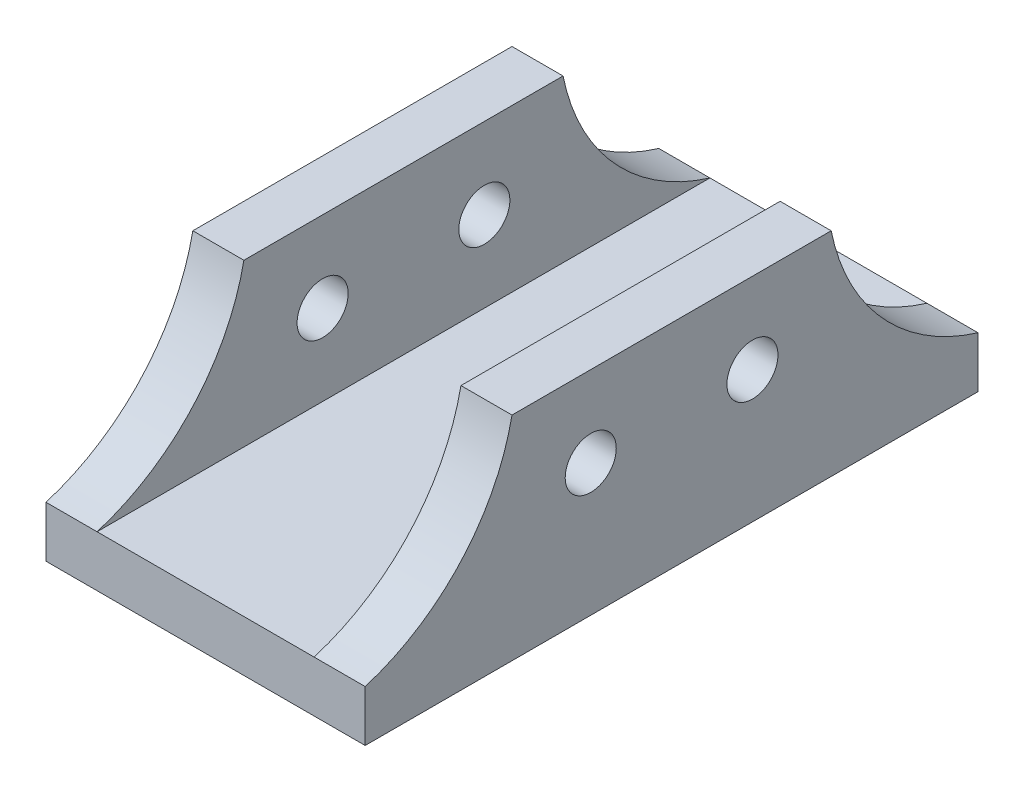
ISO-10303-21;
HEADER;
FILE_DESCRIPTION(('STEP AP214'),'2;1');
FILE_NAME('part.step','',(''),(''),'','','');
FILE_SCHEMA(('AUTOMOTIVE_DESIGN { 1 0 10303 214 1 1 1 1 }'));
ENDSEC;
DATA;
#1=APPLICATION_CONTEXT('core data for automotive mechanical design processes');
#2=APPLICATION_PROTOCOL_DEFINITION('international standard','automotive_design',2000,#1);
#3=PRODUCT_CONTEXT('',#1,'mechanical');
#4=PRODUCT('Part','Part','',(#3));
#5=PRODUCT_RELATED_PRODUCT_CATEGORY('part','',(#4));
#6=PRODUCT_DEFINITION_FORMATION('','',#4);
#7=PRODUCT_DEFINITION_CONTEXT('part definition',#1,'design');
#8=PRODUCT_DEFINITION('design','',#6,#7);
#9=PRODUCT_DEFINITION_SHAPE('','',#8);
#10=(LENGTH_UNIT() NAMED_UNIT(*) SI_UNIT(.MILLI.,.METRE.));
#11=(NAMED_UNIT(*) PLANE_ANGLE_UNIT() SI_UNIT($,.RADIAN.));
#12=(NAMED_UNIT(*) SI_UNIT($,.STERADIAN.) SOLID_ANGLE_UNIT());
#13=UNCERTAINTY_MEASURE_WITH_UNIT(LENGTH_MEASURE(1.E-05),#10,'distance_accuracy_value','');
#14=(GEOMETRIC_REPRESENTATION_CONTEXT(3) GLOBAL_UNCERTAINTY_ASSIGNED_CONTEXT((#13)) GLOBAL_UNIT_ASSIGNED_CONTEXT((#10,
#11,#12)) REPRESENTATION_CONTEXT('',''));
#15=CARTESIAN_POINT('',(0.,0.,0.));
#16=DIRECTION('',(0.,0.,1.));
#17=DIRECTION('',(1.,0.,0.));
#18=AXIS2_PLACEMENT_3D('',#15,#16,#17);
#19=CARTESIAN_POINT('',(37.5,50.,72.));
#20=DIRECTION('',(0.,-1.,0.));
#21=DIRECTION('',(0.,0.,-1.));
#22=AXIS2_PLACEMENT_3D('',#19,#20,#21);
#23=PLANE('',#22);
#24=DIRECTION('',(1.,0.,0.));
#25=VECTOR('',#24,1.);
#26=CARTESIAN_POINT('',(-37.5,50.,-37.5));
#27=LINE('',#26,#25);
#28=CARTESIAN_POINT('',(-37.5,50.,-37.5));
#29=VERTEX_POINT('',#28);
#30=CARTESIAN_POINT('',(-25.5,50.,-37.5));
#31=VERTEX_POINT('',#30);
#32=EDGE_CURVE('E53',#29,#31,#27,.T.);
#33=ORIENTED_EDGE('',*,*,#32,.F.);
#34=DIRECTION('',(0.,0.,1.));
#35=VECTOR('',#34,1.);
#36=CARTESIAN_POINT('',(-37.5,50.,72.));
#37=LINE('',#36,#35);
#38=CARTESIAN_POINT('',(-37.5,50.,37.5));
#39=VERTEX_POINT('',#38);
#40=EDGE_CURVE('E129',#29,#39,#37,.T.);
#41=ORIENTED_EDGE('',*,*,#40,.T.);
#42=DIRECTION('',(1.,0.,0.));
#43=VECTOR('',#42,1.);
#44=CARTESIAN_POINT('',(-37.5,50.,37.5));
#45=LINE('',#44,#43);
#46=CARTESIAN_POINT('',(-25.5,50.,37.5));
#47=VERTEX_POINT('',#46);
#48=EDGE_CURVE('E231',#39,#47,#45,.T.);
#49=ORIENTED_EDGE('',*,*,#48,.T.);
#50=DIRECTION('',(0.,0.,1.));
#51=VECTOR('',#50,1.);
#52=CARTESIAN_POINT('',(-25.5,50.,-72.));
#53=LINE('',#52,#51);
#54=EDGE_CURVE('E132',#31,#47,#53,.T.);
#55=ORIENTED_EDGE('',*,*,#54,.F.);
#56=EDGE_LOOP('',(#33,#41,#49,#55));
#57=FACE_BOUND('',#56,.T.);
#58=ADVANCED_FACE('F39',(#57),#23,.F.);
#59=CARTESIAN_POINT('',(25.5,50.,-37.5));
#60=VERTEX_POINT('',#59);
#61=CARTESIAN_POINT('',(37.5,50.,-37.5));
#62=VERTEX_POINT('',#61);
#63=EDGE_CURVE('E121',#60,#62,#27,.T.);
#64=ORIENTED_EDGE('',*,*,#63,.F.);
#65=DIRECTION('',(0.,0.,1.));
#66=VECTOR('',#65,1.);
#67=CARTESIAN_POINT('',(25.5,50.,-72.));
#68=LINE('',#67,#66);
#69=CARTESIAN_POINT('',(25.5,50.,37.5));
#70=VERTEX_POINT('',#69);
#71=EDGE_CURVE('E167',#60,#70,#68,.T.);
#72=ORIENTED_EDGE('',*,*,#71,.T.);
#73=CARTESIAN_POINT('',(37.5,50.,37.5));
#74=VERTEX_POINT('',#73);
#75=EDGE_CURVE('E65',#70,#74,#45,.T.);
#76=ORIENTED_EDGE('',*,*,#75,.T.);
#77=DIRECTION('',(0.,0.,1.));
#78=VECTOR('',#77,1.);
#79=CARTESIAN_POINT('',(37.5,50.,72.));
#80=LINE('',#79,#78);
#81=EDGE_CURVE('E151',#62,#74,#80,.T.);
#82=ORIENTED_EDGE('',*,*,#81,.F.);
#83=EDGE_LOOP('',(#64,#72,#76,#82));
#84=FACE_BOUND('',#83,.T.);
#85=ADVANCED_FACE('F174',(#84),#23,.F.);
#86=CARTESIAN_POINT('',(37.5,0.,72.));
#87=DIRECTION('',(0.,0.,-1.));
#88=DIRECTION('',(-1.,0.,0.));
#89=AXIS2_PLACEMENT_3D('',#86,#87,#88);
#90=PLANE('',#89);
#91=DIRECTION('',(1.,0.,0.));
#92=VECTOR('',#91,1.);
#93=CARTESIAN_POINT('',(-37.5,12.,72.));
#94=LINE('',#93,#92);
#95=CARTESIAN_POINT('',(-37.5,12.,72.));
#96=VERTEX_POINT('',#95);
#97=CARTESIAN_POINT('',(-25.5,12.,72.));
#98=VERTEX_POINT('',#97);
#99=EDGE_CURVE('E227',#96,#98,#94,.T.);
#100=ORIENTED_EDGE('',*,*,#99,.F.);
#101=DIRECTION('',(0.,-1.,0.));
#102=VECTOR('',#101,1.);
#103=CARTESIAN_POINT('',(-37.5,0.,72.));
#104=LINE('',#103,#102);
#105=CARTESIAN_POINT('',(-37.5,0.,72.));
#106=VERTEX_POINT('',#105);
#107=EDGE_CURVE('E200',#96,#106,#104,.T.);
#108=ORIENTED_EDGE('',*,*,#107,.T.);
#109=DIRECTION('',(-1.,0.,0.));
#110=VECTOR('',#109,1.);
#111=CARTESIAN_POINT('',(37.5,0.,72.));
#112=LINE('',#111,#110);
#113=CARTESIAN_POINT('',(37.5,0.,72.));
#114=VERTEX_POINT('',#113);
#115=EDGE_CURVE('E147',#114,#106,#112,.T.);
#116=ORIENTED_EDGE('',*,*,#115,.F.);
#117=DIRECTION('',(0.,-1.,0.));
#118=VECTOR('',#117,1.);
#119=CARTESIAN_POINT('',(37.5,0.,72.));
#120=LINE('',#119,#118);
#121=CARTESIAN_POINT('',(37.5,12.,72.));
#122=VERTEX_POINT('',#121);
#123=EDGE_CURVE('E140',#122,#114,#120,.T.);
#124=ORIENTED_EDGE('',*,*,#123,.F.);
#125=CARTESIAN_POINT('',(25.5,12.,72.));
#126=VERTEX_POINT('',#125);
#127=EDGE_CURVE('E228',#126,#122,#94,.T.);
#128=ORIENTED_EDGE('',*,*,#127,.F.);
#129=DIRECTION('',(1.,0.,0.));
#130=VECTOR('',#129,1.);
#131=CARTESIAN_POINT('',(-25.5,12.,72.));
#132=LINE('',#131,#130);
#133=EDGE_CURVE('E230',#98,#126,#132,.T.);
#134=ORIENTED_EDGE('',*,*,#133,.F.);
#135=EDGE_LOOP('',(#100,#108,#116,#124,#128,#134));
#136=FACE_BOUND('',#135,.T.);
#137=ADVANCED_FACE('F41',(#136),#90,.F.);
#138=CARTESIAN_POINT('',(37.5,0.,0.));
#139=DIRECTION('',(-1.,0.,0.));
#140=DIRECTION('',(0.,0.,1.));
#141=AXIS2_PLACEMENT_3D('',#138,#139,#140);
#142=PLANE('',#141);
#143=CARTESIAN_POINT('',(37.5,31.,19.));
#144=DIRECTION('',(1.,0.,0.));
#145=DIRECTION('',(0.,0.,-1.));
#146=AXIS2_PLACEMENT_3D('',#143,#144,#145);
#147=CIRCLE('',#146,6.);
#148=CARTESIAN_POINT('',(37.5,31.,13.));
#149=VERTEX_POINT('',#148);
#150=EDGE_CURVE('E198',#149,#149,#147,.T.);
#151=ORIENTED_EDGE('',*,*,#150,.F.);
#152=EDGE_LOOP('',(#151));
#153=FACE_BOUND('',#152,.T.);
#154=CARTESIAN_POINT('',(37.5,31.,-19.));
#155=DIRECTION('',(1.,0.,0.));
#156=DIRECTION('',(0.,0.,1.));
#157=AXIS2_PLACEMENT_3D('',#154,#155,#156);
#158=CIRCLE('',#157,6.);
#159=CARTESIAN_POINT('',(37.5,31.,-13.));
#160=VERTEX_POINT('',#159);
#161=EDGE_CURVE('E188',#160,#160,#158,.T.);
#162=ORIENTED_EDGE('',*,*,#161,.F.);
#163=EDGE_LOOP('',(#162));
#164=FACE_BOUND('',#163,.T.);
#165=CARTESIAN_POINT('',(37.5,59.8449036256035,-86.5211981963169));
#166=DIRECTION('',(1.,0.,0.));
#167=DIRECTION('',(0.,0.,-1.));
#168=AXIS2_PLACEMENT_3D('',#165,#166,#167);
#169=CIRCLE('',#168,50.);
#170=CARTESIAN_POINT('',(37.5,12.,-72.));
#171=VERTEX_POINT('',#170);
#172=EDGE_CURVE('E125',#62,#171,#169,.T.);
#173=ORIENTED_EDGE('',*,*,#172,.F.);
#174=ORIENTED_EDGE('',*,*,#81,.T.);
#175=CARTESIAN_POINT('',(37.5,59.8449036256035,86.5211981963169));
#176=DIRECTION('',(1.,0.,0.));
#177=DIRECTION('',(0.,0.,1.));
#178=AXIS2_PLACEMENT_3D('',#175,#176,#177);
#179=CIRCLE('',#178,50.);
#180=EDGE_CURVE('E232',#122,#74,#179,.T.);
#181=ORIENTED_EDGE('',*,*,#180,.F.);
#182=ORIENTED_EDGE('',*,*,#123,.T.);
#183=DIRECTION('',(0.,0.,-1.));
#184=VECTOR('',#183,1.);
#185=CARTESIAN_POINT('',(37.5,0.,72.));
#186=LINE('',#185,#184);
#187=CARTESIAN_POINT('',(37.5,0.,-72.));
#188=VERTEX_POINT('',#187);
#189=EDGE_CURVE('E143',#114,#188,#186,.T.);
#190=ORIENTED_EDGE('',*,*,#189,.T.);
#191=DIRECTION('',(0.,1.,0.));
#192=VECTOR('',#191,1.);
#193=CARTESIAN_POINT('',(37.5,0.,-72.));
#194=LINE('',#193,#192);
#195=EDGE_CURVE('E201',#188,#171,#194,.T.);
#196=ORIENTED_EDGE('',*,*,#195,.T.);
#197=EDGE_LOOP('',(#173,#174,#181,#182,#190,#196));
#198=FACE_BOUND('',#197,.T.);
#199=ADVANCED_FACE('F219',(#153,#164,#198),#142,.F.);
#200=CARTESIAN_POINT('',(-37.5,0.,0.));
#201=DIRECTION('',(-1.,0.,0.));
#202=DIRECTION('',(0.,0.,1.));
#203=AXIS2_PLACEMENT_3D('',#200,#201,#202);
#204=PLANE('',#203);
#205=CARTESIAN_POINT('',(-37.5,31.,19.));
#206=DIRECTION('',(1.,0.,0.));
#207=DIRECTION('',(0.,0.,-1.));
#208=AXIS2_PLACEMENT_3D('',#205,#206,#207);
#209=CIRCLE('',#208,6.);
#210=CARTESIAN_POINT('',(-37.5,31.,13.));
#211=VERTEX_POINT('',#210);
#212=EDGE_CURVE('E195',#211,#211,#209,.T.);
#213=ORIENTED_EDGE('',*,*,#212,.T.);
#214=EDGE_LOOP('',(#213));
#215=FACE_BOUND('',#214,.T.);
#216=CARTESIAN_POINT('',(-37.5,31.,-19.));
#217=DIRECTION('',(1.,0.,0.));
#218=DIRECTION('',(0.,0.,1.));
#219=AXIS2_PLACEMENT_3D('',#216,#217,#218);
#220=CIRCLE('',#219,6.);
#221=CARTESIAN_POINT('',(-37.5,31.,-13.));
#222=VERTEX_POINT('',#221);
#223=EDGE_CURVE('E186',#222,#222,#220,.T.);
#224=ORIENTED_EDGE('',*,*,#223,.T.);
#225=EDGE_LOOP('',(#224));
#226=FACE_BOUND('',#225,.T.);
#227=ORIENTED_EDGE('',*,*,#40,.F.);
#228=CARTESIAN_POINT('',(-37.5,59.8449036256035,-86.5211981963169));
#229=DIRECTION('',(1.,0.,0.));
#230=DIRECTION('',(0.,0.,-1.));
#231=AXIS2_PLACEMENT_3D('',#228,#229,#230);
#232=CIRCLE('',#231,50.);
#233=CARTESIAN_POINT('',(-37.5,12.,-72.));
#234=VERTEX_POINT('',#233);
#235=EDGE_CURVE('E111',#29,#234,#232,.T.);
#236=ORIENTED_EDGE('',*,*,#235,.T.);
#237=DIRECTION('',(0.,1.,0.));
#238=VECTOR('',#237,1.);
#239=CARTESIAN_POINT('',(-37.5,0.,-72.));
#240=LINE('',#239,#238);
#241=CARTESIAN_POINT('',(-37.5,0.,-72.));
#242=VERTEX_POINT('',#241);
#243=EDGE_CURVE('E138',#242,#234,#240,.T.);
#244=ORIENTED_EDGE('',*,*,#243,.F.);
#245=DIRECTION('',(0.,0.,-1.));
#246=VECTOR('',#245,1.);
#247=CARTESIAN_POINT('',(-37.5,0.,72.));
#248=LINE('',#247,#246);
#249=EDGE_CURVE('E141',#106,#242,#248,.T.);
#250=ORIENTED_EDGE('',*,*,#249,.F.);
#251=ORIENTED_EDGE('',*,*,#107,.F.);
#252=CARTESIAN_POINT('',(-37.5,59.8449036256035,86.5211981963169));
#253=DIRECTION('',(1.,0.,0.));
#254=DIRECTION('',(0.,0.,1.));
#255=AXIS2_PLACEMENT_3D('',#252,#253,#254);
#256=CIRCLE('',#255,50.);
#257=EDGE_CURVE('E136',#96,#39,#256,.T.);
#258=ORIENTED_EDGE('',*,*,#257,.T.);
#259=EDGE_LOOP('',(#227,#236,#244,#250,#251,#258));
#260=FACE_BOUND('',#259,.T.);
#261=ADVANCED_FACE('F133',(#215,#226,#260),#204,.T.);
#262=CARTESIAN_POINT('',(37.5,31.,19.));
#263=DIRECTION('',(-1.,0.,0.));
#264=DIRECTION('',(0.,0.,1.));
#265=AXIS2_PLACEMENT_3D('',#262,#263,#264);
#266=CYLINDRICAL_SURFACE('',#265,6.);
#267=CARTESIAN_POINT('',(-25.5,31.,19.));
#268=DIRECTION('',(-1.,0.,0.));
#269=DIRECTION('',(0.,-1.,0.));
#270=AXIS2_PLACEMENT_3D('',#267,#268,#269);
#271=CIRCLE('',#270,6.);
#272=CARTESIAN_POINT('',(-25.5,25.,19.));
#273=VERTEX_POINT('',#272);
#274=EDGE_CURVE('E159',#273,#273,#271,.T.);
#275=ORIENTED_EDGE('',*,*,#274,.F.);
#276=EDGE_LOOP('',(#275));
#277=FACE_BOUND('',#276,.T.);
#278=ORIENTED_EDGE('',*,*,#212,.F.);
#279=EDGE_LOOP('',(#278));
#280=FACE_BOUND('',#279,.T.);
#281=ADVANCED_FACE('F279',(#277,#280),#266,.F.);
#282=CARTESIAN_POINT('',(37.5,31.,-19.));
#283=DIRECTION('',(-1.,0.,0.));
#284=DIRECTION('',(0.,0.,1.));
#285=AXIS2_PLACEMENT_3D('',#282,#283,#284);
#286=CYLINDRICAL_SURFACE('',#285,6.);
#287=CARTESIAN_POINT('',(-25.5,31.,-19.));
#288=DIRECTION('',(-1.,0.,0.));
#289=DIRECTION('',(0.,-1.,0.));
#290=AXIS2_PLACEMENT_3D('',#287,#288,#289);
#291=CIRCLE('',#290,6.);
#292=CARTESIAN_POINT('',(-25.5,25.,-19.));
#293=VERTEX_POINT('',#292);
#294=EDGE_CURVE('E158',#293,#293,#291,.T.);
#295=ORIENTED_EDGE('',*,*,#294,.F.);
#296=EDGE_LOOP('',(#295));
#297=FACE_BOUND('',#296,.T.);
#298=ORIENTED_EDGE('',*,*,#223,.F.);
#299=EDGE_LOOP('',(#298));
#300=FACE_BOUND('',#299,.T.);
#301=ADVANCED_FACE('F272',(#297,#300),#286,.F.);
#302=CARTESIAN_POINT('',(37.5,0.,72.));
#303=DIRECTION('',(0.,1.,0.));
#304=DIRECTION('',(0.,0.,1.));
#305=AXIS2_PLACEMENT_3D('',#302,#303,#304);
#306=PLANE('',#305);
#307=ORIENTED_EDGE('',*,*,#249,.T.);
#308=DIRECTION('',(-1.,0.,0.));
#309=VECTOR('',#308,1.);
#310=CARTESIAN_POINT('',(37.5,0.,-72.));
#311=LINE('',#310,#309);
#312=EDGE_CURVE('E150',#188,#242,#311,.T.);
#313=ORIENTED_EDGE('',*,*,#312,.F.);
#314=ORIENTED_EDGE('',*,*,#189,.F.);
#315=ORIENTED_EDGE('',*,*,#115,.T.);
#316=EDGE_LOOP('',(#307,#313,#314,#315));
#317=FACE_BOUND('',#316,.T.);
#318=ADVANCED_FACE('F209',(#317),#306,.F.);
#319=CARTESIAN_POINT('',(37.5,0.,-72.));
#320=DIRECTION('',(0.,0.,1.));
#321=DIRECTION('',(1.,0.,0.));
#322=AXIS2_PLACEMENT_3D('',#319,#320,#321);
#323=PLANE('',#322);
#324=ORIENTED_EDGE('',*,*,#243,.T.);
#325=DIRECTION('',(1.,0.,0.));
#326=VECTOR('',#325,1.);
#327=CARTESIAN_POINT('',(-37.5,12.,-72.));
#328=LINE('',#327,#326);
#329=CARTESIAN_POINT('',(-25.5,12.,-72.));
#330=VERTEX_POINT('',#329);
#331=EDGE_CURVE('E120',#234,#330,#328,.T.);
#332=ORIENTED_EDGE('',*,*,#331,.T.);
#333=DIRECTION('',(1.,0.,0.));
#334=VECTOR('',#333,1.);
#335=CARTESIAN_POINT('',(-25.5,12.,-72.));
#336=LINE('',#335,#334);
#337=CARTESIAN_POINT('',(25.5,12.,-72.));
#338=VERTEX_POINT('',#337);
#339=EDGE_CURVE('E184',#330,#338,#336,.T.);
#340=ORIENTED_EDGE('',*,*,#339,.T.);
#341=EDGE_CURVE('E135',#338,#171,#328,.T.);
#342=ORIENTED_EDGE('',*,*,#341,.T.);
#343=ORIENTED_EDGE('',*,*,#195,.F.);
#344=ORIENTED_EDGE('',*,*,#312,.T.);
#345=EDGE_LOOP('',(#324,#332,#340,#342,#343,#344));
#346=FACE_BOUND('',#345,.T.);
#347=ADVANCED_FACE('F214',(#346),#323,.F.);
#348=CARTESIAN_POINT('',(25.5,31.,19.));
#349=DIRECTION('',(1.,0.,0.));
#350=DIRECTION('',(0.,1.,0.));
#351=AXIS2_PLACEMENT_3D('',#348,#349,#350);
#352=CIRCLE('',#351,6.);
#353=CARTESIAN_POINT('',(25.5,37.,19.));
#354=VERTEX_POINT('',#353);
#355=EDGE_CURVE('E160',#354,#354,#352,.T.);
#356=ORIENTED_EDGE('',*,*,#355,.F.);
#357=EDGE_LOOP('',(#356));
#358=FACE_BOUND('',#357,.T.);
#359=ORIENTED_EDGE('',*,*,#150,.T.);
#360=EDGE_LOOP('',(#359));
#361=FACE_BOUND('',#360,.T.);
#362=ADVANCED_FACE('F271',(#358,#361),#266,.F.);
#363=CARTESIAN_POINT('',(25.5,31.,-19.));
#364=DIRECTION('',(1.,0.,0.));
#365=DIRECTION('',(0.,1.,0.));
#366=AXIS2_PLACEMENT_3D('',#363,#364,#365);
#367=CIRCLE('',#366,6.);
#368=CARTESIAN_POINT('',(25.5,37.,-19.));
#369=VERTEX_POINT('',#368);
#370=EDGE_CURVE('E152',#369,#369,#367,.T.);
#371=ORIENTED_EDGE('',*,*,#370,.F.);
#372=EDGE_LOOP('',(#371));
#373=FACE_BOUND('',#372,.T.);
#374=ORIENTED_EDGE('',*,*,#161,.T.);
#375=EDGE_LOOP('',(#374));
#376=FACE_BOUND('',#375,.T.);
#377=ADVANCED_FACE('F282',(#373,#376),#286,.F.);
#378=CARTESIAN_POINT('',(-25.5,50.,-72.));
#379=DIRECTION('',(-1.,0.,0.));
#380=DIRECTION('',(0.,-1.,0.));
#381=AXIS2_PLACEMENT_3D('',#378,#379,#380);
#382=PLANE('',#381);
#383=ORIENTED_EDGE('',*,*,#274,.T.);
#384=EDGE_LOOP('',(#383));
#385=FACE_BOUND('',#384,.T.);
#386=ORIENTED_EDGE('',*,*,#294,.T.);
#387=EDGE_LOOP('',(#386));
#388=FACE_BOUND('',#387,.T.);
#389=DIRECTION('',(0.,0.,1.));
#390=VECTOR('',#389,1.);
#391=CARTESIAN_POINT('',(-25.5,12.,-72.));
#392=LINE('',#391,#390);
#393=EDGE_CURVE('E180',#330,#98,#392,.T.);
#394=ORIENTED_EDGE('',*,*,#393,.F.);
#395=CARTESIAN_POINT('',(-25.5,59.8449036256035,-86.5211981963169));
#396=DIRECTION('',(-1.,0.,0.));
#397=DIRECTION('',(0.,-1.,0.));
#398=AXIS2_PLACEMENT_3D('',#395,#396,#397);
#399=CIRCLE('',#398,50.);
#400=EDGE_CURVE('E238',#330,#31,#399,.T.);
#401=ORIENTED_EDGE('',*,*,#400,.T.);
#402=ORIENTED_EDGE('',*,*,#54,.T.);
#403=CARTESIAN_POINT('',(-25.5,59.8449036256035,86.5211981963169));
#404=DIRECTION('',(-1.,0.,0.));
#405=DIRECTION('',(0.,-1.,0.));
#406=AXIS2_PLACEMENT_3D('',#403,#404,#405);
#407=CIRCLE('',#406,50.);
#408=EDGE_CURVE('E236',#47,#98,#407,.T.);
#409=ORIENTED_EDGE('',*,*,#408,.T.);
#410=EDGE_LOOP('',(#394,#401,#402,#409));
#411=FACE_BOUND('',#410,.T.);
#412=ADVANCED_FACE('F246',(#385,#388,#411),#382,.F.);
#413=CARTESIAN_POINT('',(25.5,50.,-72.));
#414=DIRECTION('',(1.,0.,0.));
#415=DIRECTION('',(0.,1.,0.));
#416=AXIS2_PLACEMENT_3D('',#413,#414,#415);
#417=PLANE('',#416);
#418=ORIENTED_EDGE('',*,*,#355,.T.);
#419=EDGE_LOOP('',(#418));
#420=FACE_BOUND('',#419,.T.);
#421=ORIENTED_EDGE('',*,*,#370,.T.);
#422=EDGE_LOOP('',(#421));
#423=FACE_BOUND('',#422,.T.);
#424=ORIENTED_EDGE('',*,*,#71,.F.);
#425=CARTESIAN_POINT('',(25.5,59.8449036256035,-86.5211981963169));
#426=DIRECTION('',(1.,0.,0.));
#427=DIRECTION('',(0.,1.,0.));
#428=AXIS2_PLACEMENT_3D('',#425,#426,#427);
#429=CIRCLE('',#428,50.);
#430=EDGE_CURVE('E11',#60,#338,#429,.T.);
#431=ORIENTED_EDGE('',*,*,#430,.T.);
#432=DIRECTION('',(0.,0.,1.));
#433=VECTOR('',#432,1.);
#434=CARTESIAN_POINT('',(25.5,12.,-72.));
#435=LINE('',#434,#433);
#436=EDGE_CURVE('E169',#338,#126,#435,.T.);
#437=ORIENTED_EDGE('',*,*,#436,.T.);
#438=CARTESIAN_POINT('',(25.5,59.8449036256035,86.5211981963169));
#439=DIRECTION('',(1.,0.,0.));
#440=DIRECTION('',(0.,1.,0.));
#441=AXIS2_PLACEMENT_3D('',#438,#439,#440);
#442=CIRCLE('',#441,50.);
#443=EDGE_CURVE('E50',#126,#70,#442,.T.);
#444=ORIENTED_EDGE('',*,*,#443,.T.);
#445=EDGE_LOOP('',(#424,#431,#437,#444));
#446=FACE_BOUND('',#445,.T.);
#447=ADVANCED_FACE('F164',(#420,#423,#446),#417,.F.);
#448=CARTESIAN_POINT('',(-25.5,12.,-72.));
#449=DIRECTION('',(0.,-1.,0.));
#450=DIRECTION('',(0.,0.,-1.));
#451=AXIS2_PLACEMENT_3D('',#448,#449,#450);
#452=PLANE('',#451);
#453=ORIENTED_EDGE('',*,*,#133,.T.);
#454=ORIENTED_EDGE('',*,*,#436,.F.);
#455=ORIENTED_EDGE('',*,*,#339,.F.);
#456=ORIENTED_EDGE('',*,*,#393,.T.);
#457=EDGE_LOOP('',(#453,#454,#455,#456));
#458=FACE_BOUND('',#457,.T.);
#459=ADVANCED_FACE('F244',(#458),#452,.F.);
#460=CARTESIAN_POINT('',(-37.5,59.8449036256035,86.5211981963169));
#461=DIRECTION('',(1.,0.,0.));
#462=DIRECTION('',(0.,0.,-1.));
#463=AXIS2_PLACEMENT_3D('',#460,#461,#462);
#464=CYLINDRICAL_SURFACE('',#463,50.);
#465=ORIENTED_EDGE('',*,*,#127,.T.);
#466=ORIENTED_EDGE('',*,*,#180,.T.);
#467=ORIENTED_EDGE('',*,*,#75,.F.);
#468=ORIENTED_EDGE('',*,*,#443,.F.);
#469=EDGE_LOOP('',(#465,#466,#467,#468));
#470=FACE_BOUND('',#469,.T.);
#471=ADVANCED_FACE('F252',(#470),#464,.F.);
#472=CARTESIAN_POINT('',(-37.5,59.8449036256035,-86.5211981963169));
#473=DIRECTION('',(1.,0.,0.));
#474=DIRECTION('',(0.,0.,-1.));
#475=AXIS2_PLACEMENT_3D('',#472,#473,#474);
#476=CYLINDRICAL_SURFACE('',#475,50.);
#477=ORIENTED_EDGE('',*,*,#63,.T.);
#478=ORIENTED_EDGE('',*,*,#172,.T.);
#479=ORIENTED_EDGE('',*,*,#341,.F.);
#480=ORIENTED_EDGE('',*,*,#430,.F.);
#481=EDGE_LOOP('',(#477,#478,#479,#480));
#482=FACE_BOUND('',#481,.T.);
#483=ADVANCED_FACE('F247',(#482),#476,.F.);
#484=ORIENTED_EDGE('',*,*,#48,.F.);
#485=ORIENTED_EDGE('',*,*,#257,.F.);
#486=ORIENTED_EDGE('',*,*,#99,.T.);
#487=ORIENTED_EDGE('',*,*,#408,.F.);
#488=EDGE_LOOP('',(#484,#485,#486,#487));
#489=FACE_BOUND('',#488,.T.);
#490=ADVANCED_FACE('F250',(#489),#464,.F.);
#491=ORIENTED_EDGE('',*,*,#331,.F.);
#492=ORIENTED_EDGE('',*,*,#235,.F.);
#493=ORIENTED_EDGE('',*,*,#32,.T.);
#494=ORIENTED_EDGE('',*,*,#400,.F.);
#495=EDGE_LOOP('',(#491,#492,#493,#494));
#496=FACE_BOUND('',#495,.T.);
#497=ADVANCED_FACE('F113',(#496),#476,.F.);
#498=CLOSED_SHELL('',(#58,#85,#137,#199,#261,#281,#301,#318,#347,#362,#377,#412,#447,#459,#471,
#483,#490,#497));
#499=MANIFOLD_SOLID_BREP('B2',#498);
#500=ADVANCED_BREP_SHAPE_REPRESENTATION('',(#18,#499),#14);
#501=SHAPE_DEFINITION_REPRESENTATION(#9,#500);
ENDSEC;
END-ISO-10303-21;
